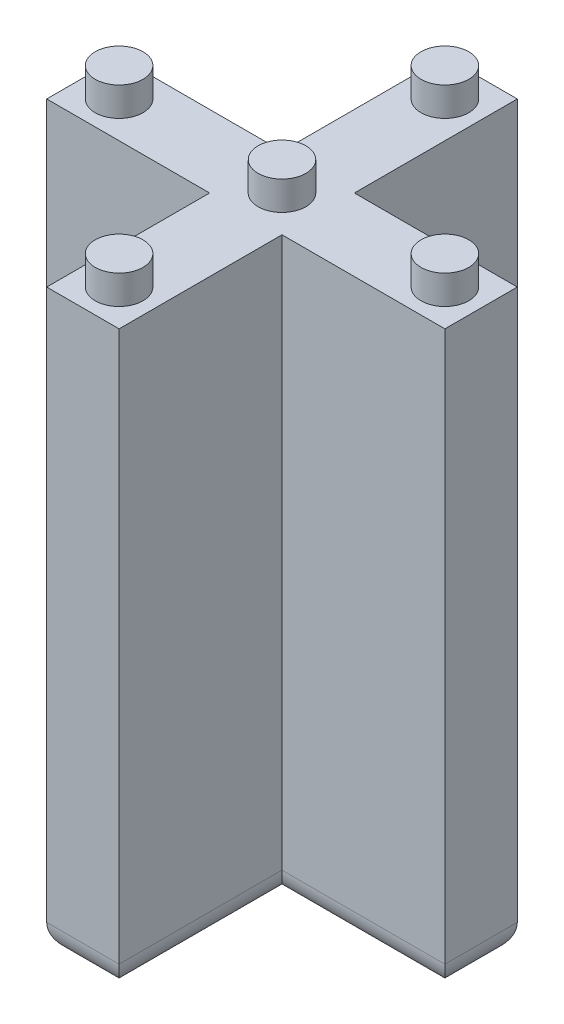
ISO-10303-21;
HEADER;
FILE_DESCRIPTION(('STEP AP214'),'2;1');
FILE_NAME('part.step','',(''),(''),'','','');
FILE_SCHEMA(('AUTOMOTIVE_DESIGN { 1 0 10303 214 1 1 1 1 }'));
ENDSEC;
DATA;
#1=APPLICATION_CONTEXT('core data for automotive mechanical design processes');
#2=APPLICATION_PROTOCOL_DEFINITION('international standard','automotive_design',2000,#1);
#3=PRODUCT_CONTEXT('',#1,'mechanical');
#4=PRODUCT('Part','Part','',(#3));
#5=PRODUCT_RELATED_PRODUCT_CATEGORY('part','',(#4));
#6=PRODUCT_DEFINITION_FORMATION('','',#4);
#7=PRODUCT_DEFINITION_CONTEXT('part definition',#1,'design');
#8=PRODUCT_DEFINITION('design','',#6,#7);
#9=PRODUCT_DEFINITION_SHAPE('','',#8);
#10=(LENGTH_UNIT() NAMED_UNIT(*) SI_UNIT(.MILLI.,.METRE.));
#11=(NAMED_UNIT(*) PLANE_ANGLE_UNIT() SI_UNIT($,.RADIAN.));
#12=(NAMED_UNIT(*) SI_UNIT($,.STERADIAN.) SOLID_ANGLE_UNIT());
#13=UNCERTAINTY_MEASURE_WITH_UNIT(LENGTH_MEASURE(1.E-05),#10,'distance_accuracy_value','');
#14=(GEOMETRIC_REPRESENTATION_CONTEXT(3) GLOBAL_UNCERTAINTY_ASSIGNED_CONTEXT((#13)) GLOBAL_UNIT_ASSIGNED_CONTEXT((#10,
#11,#12)) REPRESENTATION_CONTEXT('',''));
#15=CARTESIAN_POINT('',(0.,0.,0.));
#16=DIRECTION('',(0.,0.,1.));
#17=DIRECTION('',(1.,0.,0.));
#18=AXIS2_PLACEMENT_3D('',#15,#16,#17);
#19=CARTESIAN_POINT('',(0.,40.,-2.5));
#20=DIRECTION('',(0.,0.,-1.));
#21=DIRECTION('',(-1.,0.,0.));
#22=AXIS2_PLACEMENT_3D('',#19,#20,#21);
#23=PLANE('',#22);
#24=DIRECTION('',(0.,-1.,0.));
#25=VECTOR('',#24,1.);
#26=CARTESIAN_POINT('',(13.75,40.,-2.5));
#27=LINE('',#26,#25);
#28=CARTESIAN_POINT('',(13.75,40.,-2.5));
#29=VERTEX_POINT('',#28);
#30=CARTESIAN_POINT('',(13.75,2.,-2.5));
#31=VERTEX_POINT('',#30);
#32=EDGE_CURVE('E215',#29,#31,#27,.T.);
#33=ORIENTED_EDGE('',*,*,#32,.T.);
#34=DIRECTION('',(1.,0.,0.));
#35=VECTOR('',#34,1.);
#36=CARTESIAN_POINT('',(2.5,2.,-2.5));
#37=LINE('',#36,#35);
#38=CARTESIAN_POINT('',(2.5,2.,-2.5));
#39=VERTEX_POINT('',#38);
#40=EDGE_CURVE('E11',#31,#39,#37,.F.);
#41=ORIENTED_EDGE('',*,*,#40,.T.);
#42=DIRECTION('',(0.,-1.,0.));
#43=VECTOR('',#42,1.);
#44=CARTESIAN_POINT('',(2.5,40.,-2.5));
#45=LINE('',#44,#43);
#46=CARTESIAN_POINT('',(2.5,40.,-2.5));
#47=VERTEX_POINT('',#46);
#48=EDGE_CURVE('E163',#47,#39,#45,.T.);
#49=ORIENTED_EDGE('',*,*,#48,.F.);
#50=DIRECTION('',(1.,0.,0.));
#51=VECTOR('',#50,1.);
#52=CARTESIAN_POINT('',(0.,40.,-2.5));
#53=LINE('',#52,#51);
#54=EDGE_CURVE('E166',#47,#29,#53,.T.);
#55=ORIENTED_EDGE('',*,*,#54,.T.);
#56=EDGE_LOOP('',(#33,#41,#49,#55));
#57=FACE_BOUND('',#56,.T.);
#58=ADVANCED_FACE('F35',(#57),#23,.T.);
#59=CARTESIAN_POINT('',(2.5,40.,0.));
#60=DIRECTION('',(-1.,0.,0.));
#61=DIRECTION('',(0.,0.,1.));
#62=AXIS2_PLACEMENT_3D('',#59,#60,#61);
#63=PLANE('',#62);
#64=ORIENTED_EDGE('',*,*,#48,.T.);
#65=DIRECTION('',(0.,0.,-1.));
#66=VECTOR('',#65,1.);
#67=CARTESIAN_POINT('',(2.5,2.,0.));
#68=LINE('',#67,#66);
#69=CARTESIAN_POINT('',(2.5,2.,-13.75));
#70=VERTEX_POINT('',#69);
#71=EDGE_CURVE('E248',#39,#70,#68,.T.);
#72=ORIENTED_EDGE('',*,*,#71,.T.);
#73=DIRECTION('',(0.,-1.,0.));
#74=VECTOR('',#73,1.);
#75=CARTESIAN_POINT('',(2.5,40.,-13.75));
#76=LINE('',#75,#74);
#77=CARTESIAN_POINT('',(2.5,40.,-13.75));
#78=VERTEX_POINT('',#77);
#79=EDGE_CURVE('E172',#78,#70,#76,.T.);
#80=ORIENTED_EDGE('',*,*,#79,.F.);
#81=DIRECTION('',(0.,0.,-1.));
#82=VECTOR('',#81,1.);
#83=CARTESIAN_POINT('',(2.5,40.,0.));
#84=LINE('',#83,#82);
#85=EDGE_CURVE('E175',#47,#78,#84,.T.);
#86=ORIENTED_EDGE('',*,*,#85,.F.);
#87=EDGE_LOOP('',(#64,#72,#80,#86));
#88=FACE_BOUND('',#87,.T.);
#89=ADVANCED_FACE('F176',(#88),#63,.F.);
#90=CARTESIAN_POINT('',(0.,40.,-13.75));
#91=DIRECTION('',(0.,0.,-1.));
#92=DIRECTION('',(-1.,0.,0.));
#93=AXIS2_PLACEMENT_3D('',#90,#91,#92);
#94=PLANE('',#93);
#95=ORIENTED_EDGE('',*,*,#79,.T.);
#96=DIRECTION('',(1.,0.,0.));
#97=VECTOR('',#96,1.);
#98=CARTESIAN_POINT('',(-2.5,2.,-13.75));
#99=LINE('',#98,#97);
#100=CARTESIAN_POINT('',(-2.5,2.,-13.75));
#101=VERTEX_POINT('',#100);
#102=EDGE_CURVE('E275',#70,#101,#99,.F.);
#103=ORIENTED_EDGE('',*,*,#102,.T.);
#104=DIRECTION('',(0.,-1.,0.));
#105=VECTOR('',#104,1.);
#106=CARTESIAN_POINT('',(-2.5,40.,-13.75));
#107=LINE('',#106,#105);
#108=CARTESIAN_POINT('',(-2.5,40.,-13.75));
#109=VERTEX_POINT('',#108);
#110=EDGE_CURVE('E239',#109,#101,#107,.T.);
#111=ORIENTED_EDGE('',*,*,#110,.F.);
#112=DIRECTION('',(1.,0.,0.));
#113=VECTOR('',#112,1.);
#114=CARTESIAN_POINT('',(0.,40.,-13.75));
#115=LINE('',#114,#113);
#116=EDGE_CURVE('E181',#109,#78,#115,.T.);
#117=ORIENTED_EDGE('',*,*,#116,.T.);
#118=EDGE_LOOP('',(#95,#103,#111,#117));
#119=FACE_BOUND('',#118,.T.);
#120=ADVANCED_FACE('F384',(#119),#94,.T.);
#121=CARTESIAN_POINT('',(-2.5,40.,0.));
#122=DIRECTION('',(-1.,0.,0.));
#123=DIRECTION('',(0.,0.,1.));
#124=AXIS2_PLACEMENT_3D('',#121,#122,#123);
#125=PLANE('',#124);
#126=ORIENTED_EDGE('',*,*,#110,.T.);
#127=DIRECTION('',(0.,0.,-1.));
#128=VECTOR('',#127,1.);
#129=CARTESIAN_POINT('',(-2.5,2.,-2.5));
#130=LINE('',#129,#128);
#131=CARTESIAN_POINT('',(-2.5,2.,-2.5));
#132=VERTEX_POINT('',#131);
#133=EDGE_CURVE('E277',#101,#132,#130,.F.);
#134=ORIENTED_EDGE('',*,*,#133,.T.);
#135=DIRECTION('',(0.,-1.,0.));
#136=VECTOR('',#135,1.);
#137=CARTESIAN_POINT('',(-2.5,40.,-2.5));
#138=LINE('',#137,#136);
#139=CARTESIAN_POINT('',(-2.5,40.,-2.5));
#140=VERTEX_POINT('',#139);
#141=EDGE_CURVE('E236',#140,#132,#138,.T.);
#142=ORIENTED_EDGE('',*,*,#141,.F.);
#143=DIRECTION('',(0.,0.,-1.));
#144=VECTOR('',#143,1.);
#145=CARTESIAN_POINT('',(-2.5,40.,0.));
#146=LINE('',#145,#144);
#147=EDGE_CURVE('E194',#140,#109,#146,.T.);
#148=ORIENTED_EDGE('',*,*,#147,.T.);
#149=EDGE_LOOP('',(#126,#134,#142,#148));
#150=FACE_BOUND('',#149,.T.);
#151=ADVANCED_FACE('F487',(#150),#125,.T.);
#152=CARTESIAN_POINT('',(0.,40.,-2.5));
#153=DIRECTION('',(0.,0.,-1.));
#154=DIRECTION('',(-1.,0.,0.));
#155=AXIS2_PLACEMENT_3D('',#152,#153,#154);
#156=PLANE('',#155);
#157=ORIENTED_EDGE('',*,*,#141,.T.);
#158=DIRECTION('',(1.,0.,0.));
#159=VECTOR('',#158,1.);
#160=CARTESIAN_POINT('',(-13.75,2.,-2.5));
#161=LINE('',#160,#159);
#162=CARTESIAN_POINT('',(-13.75,2.,-2.5));
#163=VERTEX_POINT('',#162);
#164=EDGE_CURVE('E279',#132,#163,#161,.F.);
#165=ORIENTED_EDGE('',*,*,#164,.T.);
#166=DIRECTION('',(0.,-1.,0.));
#167=VECTOR('',#166,1.);
#168=CARTESIAN_POINT('',(-13.75,40.,-2.5));
#169=LINE('',#168,#167);
#170=CARTESIAN_POINT('',(-13.75,40.,-2.5));
#171=VERTEX_POINT('',#170);
#172=EDGE_CURVE('E233',#171,#163,#169,.T.);
#173=ORIENTED_EDGE('',*,*,#172,.F.);
#174=DIRECTION('',(1.,0.,0.));
#175=VECTOR('',#174,1.);
#176=CARTESIAN_POINT('',(0.,40.,-2.5));
#177=LINE('',#176,#175);
#178=EDGE_CURVE('E197',#171,#140,#177,.T.);
#179=ORIENTED_EDGE('',*,*,#178,.T.);
#180=EDGE_LOOP('',(#157,#165,#173,#179));
#181=FACE_BOUND('',#180,.T.);
#182=ADVANCED_FACE('F489',(#181),#156,.T.);
#183=CARTESIAN_POINT('',(-13.75,40.,0.));
#184=DIRECTION('',(-1.,0.,0.));
#185=DIRECTION('',(0.,0.,1.));
#186=AXIS2_PLACEMENT_3D('',#183,#184,#185);
#187=PLANE('',#186);
#188=ORIENTED_EDGE('',*,*,#172,.T.);
#189=DIRECTION('',(0.,0.,-1.));
#190=VECTOR('',#189,1.);
#191=CARTESIAN_POINT('',(-13.75,2.,2.5));
#192=LINE('',#191,#190);
#193=CARTESIAN_POINT('',(-13.75,2.,2.5));
#194=VERTEX_POINT('',#193);
#195=EDGE_CURVE('E281',#163,#194,#192,.F.);
#196=ORIENTED_EDGE('',*,*,#195,.T.);
#197=DIRECTION('',(0.,-1.,0.));
#198=VECTOR('',#197,1.);
#199=CARTESIAN_POINT('',(-13.75,40.,2.5));
#200=LINE('',#199,#198);
#201=CARTESIAN_POINT('',(-13.75,40.,2.5));
#202=VERTEX_POINT('',#201);
#203=EDGE_CURVE('E230',#202,#194,#200,.T.);
#204=ORIENTED_EDGE('',*,*,#203,.F.);
#205=DIRECTION('',(0.,0.,-1.));
#206=VECTOR('',#205,1.);
#207=CARTESIAN_POINT('',(-13.75,40.,0.));
#208=LINE('',#207,#206);
#209=EDGE_CURVE('E200',#202,#171,#208,.T.);
#210=ORIENTED_EDGE('',*,*,#209,.T.);
#211=EDGE_LOOP('',(#188,#196,#204,#210));
#212=FACE_BOUND('',#211,.T.);
#213=ADVANCED_FACE('F491',(#212),#187,.T.);
#214=CARTESIAN_POINT('',(0.,40.,2.5));
#215=DIRECTION('',(0.,0.,-1.));
#216=DIRECTION('',(-1.,0.,0.));
#217=AXIS2_PLACEMENT_3D('',#214,#215,#216);
#218=PLANE('',#217);
#219=ORIENTED_EDGE('',*,*,#203,.T.);
#220=DIRECTION('',(1.,0.,0.));
#221=VECTOR('',#220,1.);
#222=CARTESIAN_POINT('',(0.,2.,2.5));
#223=LINE('',#222,#221);
#224=CARTESIAN_POINT('',(-2.5,2.,2.5));
#225=VERTEX_POINT('',#224);
#226=EDGE_CURVE('E283',#194,#225,#223,.T.);
#227=ORIENTED_EDGE('',*,*,#226,.T.);
#228=DIRECTION('',(0.,-1.,0.));
#229=VECTOR('',#228,1.);
#230=CARTESIAN_POINT('',(-2.5,40.,2.5));
#231=LINE('',#230,#229);
#232=CARTESIAN_POINT('',(-2.5,40.,2.5));
#233=VERTEX_POINT('',#232);
#234=EDGE_CURVE('E227',#233,#225,#231,.T.);
#235=ORIENTED_EDGE('',*,*,#234,.F.);
#236=DIRECTION('',(1.,0.,0.));
#237=VECTOR('',#236,1.);
#238=CARTESIAN_POINT('',(0.,40.,2.5));
#239=LINE('',#238,#237);
#240=EDGE_CURVE('E203',#202,#233,#239,.T.);
#241=ORIENTED_EDGE('',*,*,#240,.F.);
#242=EDGE_LOOP('',(#219,#227,#235,#241));
#243=FACE_BOUND('',#242,.T.);
#244=ADVANCED_FACE('F464',(#243),#218,.F.);
#245=CARTESIAN_POINT('',(-2.5,40.,0.));
#246=DIRECTION('',(-1.,0.,0.));
#247=DIRECTION('',(0.,0.,1.));
#248=AXIS2_PLACEMENT_3D('',#245,#246,#247);
#249=PLANE('',#248);
#250=ORIENTED_EDGE('',*,*,#234,.T.);
#251=DIRECTION('',(0.,0.,-1.));
#252=VECTOR('',#251,1.);
#253=CARTESIAN_POINT('',(-2.5,2.,13.75));
#254=LINE('',#253,#252);
#255=CARTESIAN_POINT('',(-2.5,2.,13.75));
#256=VERTEX_POINT('',#255);
#257=EDGE_CURVE('E285',#225,#256,#254,.F.);
#258=ORIENTED_EDGE('',*,*,#257,.T.);
#259=DIRECTION('',(0.,-1.,0.));
#260=VECTOR('',#259,1.);
#261=CARTESIAN_POINT('',(-2.5,40.,13.75));
#262=LINE('',#261,#260);
#263=CARTESIAN_POINT('',(-2.5,40.,13.75));
#264=VERTEX_POINT('',#263);
#265=EDGE_CURVE('E224',#264,#256,#262,.T.);
#266=ORIENTED_EDGE('',*,*,#265,.F.);
#267=DIRECTION('',(0.,0.,-1.));
#268=VECTOR('',#267,1.);
#269=CARTESIAN_POINT('',(-2.5,40.,0.));
#270=LINE('',#269,#268);
#271=EDGE_CURVE('E205',#264,#233,#270,.T.);
#272=ORIENTED_EDGE('',*,*,#271,.T.);
#273=EDGE_LOOP('',(#250,#258,#266,#272));
#274=FACE_BOUND('',#273,.T.);
#275=ADVANCED_FACE('F460',(#274),#249,.T.);
#276=CARTESIAN_POINT('',(0.,40.,13.75));
#277=DIRECTION('',(0.,0.,-1.));
#278=DIRECTION('',(-1.,0.,0.));
#279=AXIS2_PLACEMENT_3D('',#276,#277,#278);
#280=PLANE('',#279);
#281=ORIENTED_EDGE('',*,*,#265,.T.);
#282=DIRECTION('',(1.,0.,0.));
#283=VECTOR('',#282,1.);
#284=CARTESIAN_POINT('',(0.,2.,13.75));
#285=LINE('',#284,#283);
#286=CARTESIAN_POINT('',(2.5,2.,13.75));
#287=VERTEX_POINT('',#286);
#288=EDGE_CURVE('E287',#256,#287,#285,.T.);
#289=ORIENTED_EDGE('',*,*,#288,.T.);
#290=DIRECTION('',(0.,-1.,0.));
#291=VECTOR('',#290,1.);
#292=CARTESIAN_POINT('',(2.5,40.,13.75));
#293=LINE('',#292,#291);
#294=CARTESIAN_POINT('',(2.5,40.,13.75));
#295=VERTEX_POINT('',#294);
#296=EDGE_CURVE('E221',#295,#287,#293,.T.);
#297=ORIENTED_EDGE('',*,*,#296,.F.);
#298=DIRECTION('',(1.,0.,0.));
#299=VECTOR('',#298,1.);
#300=CARTESIAN_POINT('',(0.,40.,13.75));
#301=LINE('',#300,#299);
#302=EDGE_CURVE('E208',#264,#295,#301,.T.);
#303=ORIENTED_EDGE('',*,*,#302,.F.);
#304=EDGE_LOOP('',(#281,#289,#297,#303));
#305=FACE_BOUND('',#304,.T.);
#306=ADVANCED_FACE('F458',(#305),#280,.F.);
#307=CARTESIAN_POINT('',(2.5,40.,0.));
#308=DIRECTION('',(-1.,0.,0.));
#309=DIRECTION('',(0.,0.,1.));
#310=AXIS2_PLACEMENT_3D('',#307,#308,#309);
#311=PLANE('',#310);
#312=ORIENTED_EDGE('',*,*,#296,.T.);
#313=DIRECTION('',(0.,0.,-1.));
#314=VECTOR('',#313,1.);
#315=CARTESIAN_POINT('',(2.5,2.,0.));
#316=LINE('',#315,#314);
#317=CARTESIAN_POINT('',(2.5,2.,2.5));
#318=VERTEX_POINT('',#317);
#319=EDGE_CURVE('E289',#287,#318,#316,.T.);
#320=ORIENTED_EDGE('',*,*,#319,.T.);
#321=DIRECTION('',(0.,-1.,0.));
#322=VECTOR('',#321,1.);
#323=CARTESIAN_POINT('',(2.5,40.,2.5));
#324=LINE('',#323,#322);
#325=CARTESIAN_POINT('',(2.5,40.,2.5));
#326=VERTEX_POINT('',#325);
#327=EDGE_CURVE('E219',#326,#318,#324,.T.);
#328=ORIENTED_EDGE('',*,*,#327,.F.);
#329=DIRECTION('',(0.,0.,-1.));
#330=VECTOR('',#329,1.);
#331=CARTESIAN_POINT('',(2.5,40.,0.));
#332=LINE('',#331,#330);
#333=EDGE_CURVE('E210',#295,#326,#332,.T.);
#334=ORIENTED_EDGE('',*,*,#333,.F.);
#335=EDGE_LOOP('',(#312,#320,#328,#334));
#336=FACE_BOUND('',#335,.T.);
#337=ADVANCED_FACE('F450',(#336),#311,.F.);
#338=CARTESIAN_POINT('',(0.,40.,2.5));
#339=DIRECTION('',(0.,0.,-1.));
#340=DIRECTION('',(-1.,0.,0.));
#341=AXIS2_PLACEMENT_3D('',#338,#339,#340);
#342=PLANE('',#341);
#343=ORIENTED_EDGE('',*,*,#327,.T.);
#344=DIRECTION('',(1.,0.,0.));
#345=VECTOR('',#344,1.);
#346=CARTESIAN_POINT('',(0.,2.,2.5));
#347=LINE('',#346,#345);
#348=CARTESIAN_POINT('',(13.75,2.,2.5));
#349=VERTEX_POINT('',#348);
#350=EDGE_CURVE('E59',#318,#349,#347,.T.);
#351=ORIENTED_EDGE('',*,*,#350,.T.);
#352=DIRECTION('',(0.,-1.,0.));
#353=VECTOR('',#352,1.);
#354=CARTESIAN_POINT('',(13.75,40.,2.5));
#355=LINE('',#354,#353);
#356=CARTESIAN_POINT('',(13.75,40.,2.5));
#357=VERTEX_POINT('',#356);
#358=EDGE_CURVE('E217',#357,#349,#355,.T.);
#359=ORIENTED_EDGE('',*,*,#358,.F.);
#360=DIRECTION('',(1.,0.,0.));
#361=VECTOR('',#360,1.);
#362=CARTESIAN_POINT('',(0.,40.,2.5));
#363=LINE('',#362,#361);
#364=EDGE_CURVE('E212',#326,#357,#363,.T.);
#365=ORIENTED_EDGE('',*,*,#364,.F.);
#366=EDGE_LOOP('',(#343,#351,#359,#365));
#367=FACE_BOUND('',#366,.T.);
#368=ADVANCED_FACE('F454',(#367),#342,.F.);
#369=CARTESIAN_POINT('',(13.75,40.,0.));
#370=DIRECTION('',(-1.,0.,0.));
#371=DIRECTION('',(0.,0.,1.));
#372=AXIS2_PLACEMENT_3D('',#369,#370,#371);
#373=PLANE('',#372);
#374=ORIENTED_EDGE('',*,*,#358,.T.);
#375=DIRECTION('',(0.,0.,-1.));
#376=VECTOR('',#375,1.);
#377=CARTESIAN_POINT('',(13.75,2.,0.));
#378=LINE('',#377,#376);
#379=EDGE_CURVE('E44',#349,#31,#378,.T.);
#380=ORIENTED_EDGE('',*,*,#379,.T.);
#381=ORIENTED_EDGE('',*,*,#32,.F.);
#382=DIRECTION('',(0.,0.,-1.));
#383=VECTOR('',#382,1.);
#384=CARTESIAN_POINT('',(13.75,40.,0.));
#385=LINE('',#384,#383);
#386=EDGE_CURVE('E185',#357,#29,#385,.T.);
#387=ORIENTED_EDGE('',*,*,#386,.F.);
#388=EDGE_LOOP('',(#374,#380,#381,#387));
#389=FACE_BOUND('',#388,.T.);
#390=ADVANCED_FACE('F359',(#389),#373,.F.);
#391=CARTESIAN_POINT('',(0.,40.,0.));
#392=DIRECTION('',(0.,1.,0.));
#393=DIRECTION('',(0.,0.,1.));
#394=AXIS2_PLACEMENT_3D('',#391,#392,#393);
#395=PLANE('',#394);
#396=CARTESIAN_POINT('',(0.,40.,11.25));
#397=DIRECTION('',(0.,1.,0.));
#398=DIRECTION('',(0.,0.,1.));
#399=AXIS2_PLACEMENT_3D('',#396,#397,#398);
#400=CIRCLE('',#399,1.65);
#401=CARTESIAN_POINT('',(0.,40.,12.9));
#402=VERTEX_POINT('',#401);
#403=EDGE_CURVE('E245',#402,#402,#400,.T.);
#404=ORIENTED_EDGE('',*,*,#403,.F.);
#405=EDGE_LOOP('',(#404));
#406=FACE_BOUND('',#405,.T.);
#407=CARTESIAN_POINT('',(11.25,40.,0.));
#408=DIRECTION('',(0.,1.,0.));
#409=DIRECTION('',(0.,0.,1.));
#410=AXIS2_PLACEMENT_3D('',#407,#408,#409);
#411=CIRCLE('',#410,1.65);
#412=CARTESIAN_POINT('',(11.25,40.,1.65));
#413=VERTEX_POINT('',#412);
#414=EDGE_CURVE('E333',#413,#413,#411,.T.);
#415=ORIENTED_EDGE('',*,*,#414,.F.);
#416=EDGE_LOOP('',(#415));
#417=FACE_BOUND('',#416,.T.);
#418=CARTESIAN_POINT('',(0.,40.,-11.25));
#419=DIRECTION('',(0.,1.,0.));
#420=DIRECTION('',(0.,0.,1.));
#421=AXIS2_PLACEMENT_3D('',#418,#419,#420);
#422=CIRCLE('',#421,1.65);
#423=CARTESIAN_POINT('',(0.,40.,-9.6));
#424=VERTEX_POINT('',#423);
#425=EDGE_CURVE('E342',#424,#424,#422,.T.);
#426=ORIENTED_EDGE('',*,*,#425,.F.);
#427=EDGE_LOOP('',(#426));
#428=FACE_BOUND('',#427,.T.);
#429=CARTESIAN_POINT('',(0.,40.,0.));
#430=DIRECTION('',(0.,1.,0.));
#431=DIRECTION('',(0.,0.,1.));
#432=AXIS2_PLACEMENT_3D('',#429,#430,#431);
#433=CIRCLE('',#432,1.65);
#434=CARTESIAN_POINT('',(0.,40.,1.65));
#435=VERTEX_POINT('',#434);
#436=EDGE_CURVE('E347',#435,#435,#433,.T.);
#437=ORIENTED_EDGE('',*,*,#436,.F.);
#438=EDGE_LOOP('',(#437));
#439=FACE_BOUND('',#438,.T.);
#440=CARTESIAN_POINT('',(-11.25,40.,0.));
#441=DIRECTION('',(0.,1.,0.));
#442=DIRECTION('',(0.,0.,1.));
#443=AXIS2_PLACEMENT_3D('',#440,#441,#442);
#444=CIRCLE('',#443,1.65);
#445=CARTESIAN_POINT('',(-11.25,40.,1.65));
#446=VERTEX_POINT('',#445);
#447=EDGE_CURVE('E171',#446,#446,#444,.T.);
#448=ORIENTED_EDGE('',*,*,#447,.F.);
#449=EDGE_LOOP('',(#448));
#450=FACE_BOUND('',#449,.T.);
#451=ORIENTED_EDGE('',*,*,#54,.F.);
#452=ORIENTED_EDGE('',*,*,#85,.T.);
#453=ORIENTED_EDGE('',*,*,#116,.F.);
#454=ORIENTED_EDGE('',*,*,#147,.F.);
#455=ORIENTED_EDGE('',*,*,#178,.F.);
#456=ORIENTED_EDGE('',*,*,#209,.F.);
#457=ORIENTED_EDGE('',*,*,#240,.T.);
#458=ORIENTED_EDGE('',*,*,#271,.F.);
#459=ORIENTED_EDGE('',*,*,#302,.T.);
#460=ORIENTED_EDGE('',*,*,#333,.T.);
#461=ORIENTED_EDGE('',*,*,#364,.T.);
#462=ORIENTED_EDGE('',*,*,#386,.T.);
#463=EDGE_LOOP('',(#451,#452,#453,#454,#455,#456,#457,#458,#459,#460,#461,#462));
#464=FACE_BOUND('',#463,.T.);
#465=ADVANCED_FACE('F183',(#406,#417,#428,#439,#450,#464),#395,.T.);
#466=CARTESIAN_POINT('',(0.,0.,0.));
#467=DIRECTION('',(0.,1.,0.));
#468=DIRECTION('',(0.,0.,1.));
#469=AXIS2_PLACEMENT_3D('',#466,#467,#468);
#470=PLANE('',#469);
#471=DIRECTION('',(1.,0.,0.));
#472=VECTOR('',#471,1.);
#473=CARTESIAN_POINT('',(2.5,0.,-11.75));
#474=LINE('',#473,#472);
#475=CARTESIAN_POINT('',(-0.499999999999999,0.,-11.75));
#476=VERTEX_POINT('',#475);
#477=CARTESIAN_POINT('',(0.500000000000001,0.,-11.75));
#478=VERTEX_POINT('',#477);
#479=EDGE_CURVE('E270',#476,#478,#474,.T.);
#480=ORIENTED_EDGE('',*,*,#479,.T.);
#481=DIRECTION('',(0.,0.,-1.));
#482=VECTOR('',#481,1.);
#483=CARTESIAN_POINT('',(0.500000000000001,0.,0.));
#484=LINE('',#483,#482);
#485=CARTESIAN_POINT('',(0.500000000000001,0.,-0.5));
#486=VERTEX_POINT('',#485);
#487=EDGE_CURVE('E272',#478,#486,#484,.F.);
#488=ORIENTED_EDGE('',*,*,#487,.T.);
#489=DIRECTION('',(1.,0.,0.));
#490=VECTOR('',#489,1.);
#491=CARTESIAN_POINT('',(13.75,0.,-0.5));
#492=LINE('',#491,#490);
#493=CARTESIAN_POINT('',(11.75,0.,-0.5));
#494=VERTEX_POINT('',#493);
#495=EDGE_CURVE('E250',#486,#494,#492,.T.);
#496=ORIENTED_EDGE('',*,*,#495,.T.);
#497=DIRECTION('',(0.,0.,-1.));
#498=VECTOR('',#497,1.);
#499=CARTESIAN_POINT('',(11.75,0.,0.));
#500=LINE('',#499,#498);
#501=CARTESIAN_POINT('',(11.75,0.,0.499999999999999));
#502=VERTEX_POINT('',#501);
#503=EDGE_CURVE('E252',#494,#502,#500,.F.);
#504=ORIENTED_EDGE('',*,*,#503,.T.);
#505=DIRECTION('',(1.,0.,0.));
#506=VECTOR('',#505,1.);
#507=CARTESIAN_POINT('',(0.,0.,0.499999999999997));
#508=LINE('',#507,#506);
#509=CARTESIAN_POINT('',(0.500000000000001,0.,0.499999999999997));
#510=VERTEX_POINT('',#509);
#511=EDGE_CURVE('E254',#502,#510,#508,.F.);
#512=ORIENTED_EDGE('',*,*,#511,.T.);
#513=DIRECTION('',(0.,0.,-1.));
#514=VECTOR('',#513,1.);
#515=CARTESIAN_POINT('',(0.500000000000001,0.,0.));
#516=LINE('',#515,#514);
#517=CARTESIAN_POINT('',(0.500000000000001,0.,11.75));
#518=VERTEX_POINT('',#517);
#519=EDGE_CURVE('E256',#510,#518,#516,.F.);
#520=ORIENTED_EDGE('',*,*,#519,.T.);
#521=DIRECTION('',(1.,0.,0.));
#522=VECTOR('',#521,1.);
#523=CARTESIAN_POINT('',(0.,0.,11.75));
#524=LINE('',#523,#522);
#525=CARTESIAN_POINT('',(-0.499999999999999,0.,11.75));
#526=VERTEX_POINT('',#525);
#527=EDGE_CURVE('E258',#518,#526,#524,.F.);
#528=ORIENTED_EDGE('',*,*,#527,.T.);
#529=DIRECTION('',(0.,0.,-1.));
#530=VECTOR('',#529,1.);
#531=CARTESIAN_POINT('',(-0.499999999999999,0.,2.5));
#532=LINE('',#531,#530);
#533=CARTESIAN_POINT('',(-0.499999999999999,0.,0.5));
#534=VERTEX_POINT('',#533);
#535=EDGE_CURVE('E260',#526,#534,#532,.T.);
#536=ORIENTED_EDGE('',*,*,#535,.T.);
#537=DIRECTION('',(1.,0.,0.));
#538=VECTOR('',#537,1.);
#539=CARTESIAN_POINT('',(0.,0.,0.5));
#540=LINE('',#539,#538);
#541=CARTESIAN_POINT('',(-11.75,0.,0.499999999999999));
#542=VERTEX_POINT('',#541);
#543=EDGE_CURVE('E262',#534,#542,#540,.F.);
#544=ORIENTED_EDGE('',*,*,#543,.T.);
#545=DIRECTION('',(0.,0.,-1.));
#546=VECTOR('',#545,1.);
#547=CARTESIAN_POINT('',(-11.75,0.,-2.5));
#548=LINE('',#547,#546);
#549=CARTESIAN_POINT('',(-11.75,0.,-0.5));
#550=VERTEX_POINT('',#549);
#551=EDGE_CURVE('E264',#542,#550,#548,.T.);
#552=ORIENTED_EDGE('',*,*,#551,.T.);
#553=DIRECTION('',(1.,0.,0.));
#554=VECTOR('',#553,1.);
#555=CARTESIAN_POINT('',(-2.5,0.,-0.5));
#556=LINE('',#555,#554);
#557=CARTESIAN_POINT('',(-0.499999999999999,0.,-0.5));
#558=VERTEX_POINT('',#557);
#559=EDGE_CURVE('E266',#550,#558,#556,.T.);
#560=ORIENTED_EDGE('',*,*,#559,.T.);
#561=DIRECTION('',(0.,0.,-1.));
#562=VECTOR('',#561,1.);
#563=CARTESIAN_POINT('',(-0.499999999999999,0.,-13.75));
#564=LINE('',#563,#562);
#565=EDGE_CURVE('E268',#558,#476,#564,.T.);
#566=ORIENTED_EDGE('',*,*,#565,.T.);
#567=EDGE_LOOP('',(#480,#488,#496,#504,#512,#520,#528,#536,#544,#552,#560,#566));
#568=FACE_BOUND('',#567,.T.);
#569=ADVANCED_FACE('F358',(#568),#470,.F.);
#570=CARTESIAN_POINT('',(-11.25,42.,0.));
#571=DIRECTION('',(0.,-1.,0.));
#572=DIRECTION('',(0.,0.,-1.));
#573=AXIS2_PLACEMENT_3D('',#570,#571,#572);
#574=CYLINDRICAL_SURFACE('',#573,1.65);
#575=CARTESIAN_POINT('',(-11.25,42.,0.));
#576=DIRECTION('',(0.,1.,0.));
#577=DIRECTION('',(0.,0.,1.));
#578=AXIS2_PLACEMENT_3D('',#575,#576,#577);
#579=CIRCLE('',#578,1.65);
#580=CARTESIAN_POINT('',(-11.25,42.,1.65));
#581=VERTEX_POINT('',#580);
#582=EDGE_CURVE('E186',#581,#581,#579,.F.);
#583=ORIENTED_EDGE('',*,*,#582,.T.);
#584=EDGE_LOOP('',(#583));
#585=FACE_BOUND('',#584,.T.);
#586=ORIENTED_EDGE('',*,*,#447,.T.);
#587=EDGE_LOOP('',(#586));
#588=FACE_BOUND('',#587,.T.);
#589=ADVANCED_FACE('F364',(#585,#588),#574,.T.);
#590=CARTESIAN_POINT('',(0.,42.,0.));
#591=DIRECTION('',(0.,1.,0.));
#592=DIRECTION('',(0.,0.,1.));
#593=AXIS2_PLACEMENT_3D('',#590,#591,#592);
#594=PLANE('',#593);
#595=ORIENTED_EDGE('',*,*,#582,.F.);
#596=EDGE_LOOP('',(#595));
#597=FACE_BOUND('',#596,.T.);
#598=ADVANCED_FACE('F366',(#597),#594,.T.);
#599=CARTESIAN_POINT('',(0.,42.,0.));
#600=DIRECTION('',(0.,-1.,0.));
#601=DIRECTION('',(0.,0.,-1.));
#602=AXIS2_PLACEMENT_3D('',#599,#600,#601);
#603=CYLINDRICAL_SURFACE('',#602,1.65);
#604=CARTESIAN_POINT('',(0.,42.,0.));
#605=DIRECTION('',(0.,1.,0.));
#606=DIRECTION('',(0.,0.,1.));
#607=AXIS2_PLACEMENT_3D('',#604,#605,#606);
#608=CIRCLE('',#607,1.65);
#609=CARTESIAN_POINT('',(0.,42.,1.65));
#610=VERTEX_POINT('',#609);
#611=EDGE_CURVE('E189',#610,#610,#608,.T.);
#612=ORIENTED_EDGE('',*,*,#611,.F.);
#613=EDGE_LOOP('',(#612));
#614=FACE_BOUND('',#613,.T.);
#615=ORIENTED_EDGE('',*,*,#436,.T.);
#616=EDGE_LOOP('',(#615));
#617=FACE_BOUND('',#616,.T.);
#618=ADVANCED_FACE('F354',(#614,#617),#603,.T.);
#619=CARTESIAN_POINT('',(0.,42.,0.));
#620=DIRECTION('',(0.,1.,0.));
#621=DIRECTION('',(0.,0.,1.));
#622=AXIS2_PLACEMENT_3D('',#619,#620,#621);
#623=PLANE('',#622);
#624=ORIENTED_EDGE('',*,*,#611,.T.);
#625=EDGE_LOOP('',(#624));
#626=FACE_BOUND('',#625,.T.);
#627=ADVANCED_FACE('F694',(#626),#623,.T.);
#628=CARTESIAN_POINT('',(0.,42.,-11.25));
#629=DIRECTION('',(0.,-1.,0.));
#630=DIRECTION('',(0.,0.,-1.));
#631=AXIS2_PLACEMENT_3D('',#628,#629,#630);
#632=CYLINDRICAL_SURFACE('',#631,1.65);
#633=CARTESIAN_POINT('',(0.,42.,-11.25));
#634=DIRECTION('',(0.,1.,0.));
#635=DIRECTION('',(0.,0.,1.));
#636=AXIS2_PLACEMENT_3D('',#633,#634,#635);
#637=CIRCLE('',#636,1.65);
#638=CARTESIAN_POINT('',(0.,42.,-9.6));
#639=VERTEX_POINT('',#638);
#640=EDGE_CURVE('E344',#639,#639,#637,.T.);
#641=ORIENTED_EDGE('',*,*,#640,.F.);
#642=EDGE_LOOP('',(#641));
#643=FACE_BOUND('',#642,.T.);
#644=ORIENTED_EDGE('',*,*,#425,.T.);
#645=EDGE_LOOP('',(#644));
#646=FACE_BOUND('',#645,.T.);
#647=ADVANCED_FACE('F685',(#643,#646),#632,.T.);
#648=CARTESIAN_POINT('',(0.,42.,0.));
#649=DIRECTION('',(0.,1.,0.));
#650=DIRECTION('',(0.,0.,1.));
#651=AXIS2_PLACEMENT_3D('',#648,#649,#650);
#652=PLANE('',#651);
#653=ORIENTED_EDGE('',*,*,#640,.T.);
#654=EDGE_LOOP('',(#653));
#655=FACE_BOUND('',#654,.T.);
#656=ADVANCED_FACE('F676',(#655),#652,.T.);
#657=CARTESIAN_POINT('',(11.25,42.,0.));
#658=DIRECTION('',(0.,-1.,0.));
#659=DIRECTION('',(0.,0.,-1.));
#660=AXIS2_PLACEMENT_3D('',#657,#658,#659);
#661=CYLINDRICAL_SURFACE('',#660,1.65);
#662=CARTESIAN_POINT('',(11.25,42.,0.));
#663=DIRECTION('',(0.,1.,0.));
#664=DIRECTION('',(0.,0.,1.));
#665=AXIS2_PLACEMENT_3D('',#662,#663,#664);
#666=CIRCLE('',#665,1.65);
#667=CARTESIAN_POINT('',(11.25,42.,1.65));
#668=VERTEX_POINT('',#667);
#669=EDGE_CURVE('E338',#668,#668,#666,.T.);
#670=ORIENTED_EDGE('',*,*,#669,.F.);
#671=EDGE_LOOP('',(#670));
#672=FACE_BOUND('',#671,.T.);
#673=ORIENTED_EDGE('',*,*,#414,.T.);
#674=EDGE_LOOP('',(#673));
#675=FACE_BOUND('',#674,.T.);
#676=ADVANCED_FACE('F667',(#672,#675),#661,.T.);
#677=CARTESIAN_POINT('',(0.,42.,0.));
#678=DIRECTION('',(0.,1.,0.));
#679=DIRECTION('',(0.,0.,1.));
#680=AXIS2_PLACEMENT_3D('',#677,#678,#679);
#681=PLANE('',#680);
#682=ORIENTED_EDGE('',*,*,#669,.T.);
#683=EDGE_LOOP('',(#682));
#684=FACE_BOUND('',#683,.T.);
#685=ADVANCED_FACE('F659',(#684),#681,.T.);
#686=CARTESIAN_POINT('',(0.,42.,11.25));
#687=DIRECTION('',(0.,-1.,0.));
#688=DIRECTION('',(0.,0.,-1.));
#689=AXIS2_PLACEMENT_3D('',#686,#687,#688);
#690=CYLINDRICAL_SURFACE('',#689,1.65);
#691=CARTESIAN_POINT('',(0.,42.,11.25));
#692=DIRECTION('',(0.,1.,0.));
#693=DIRECTION('',(0.,0.,1.));
#694=AXIS2_PLACEMENT_3D('',#691,#692,#693);
#695=CIRCLE('',#694,1.65);
#696=CARTESIAN_POINT('',(0.,42.,12.9));
#697=VERTEX_POINT('',#696);
#698=EDGE_CURVE('E327',#697,#697,#695,.F.);
#699=ORIENTED_EDGE('',*,*,#698,.T.);
#700=EDGE_LOOP('',(#699));
#701=FACE_BOUND('',#700,.T.);
#702=ORIENTED_EDGE('',*,*,#403,.T.);
#703=EDGE_LOOP('',(#702));
#704=FACE_BOUND('',#703,.T.);
#705=ADVANCED_FACE('F436',(#701,#704),#690,.T.);
#706=CARTESIAN_POINT('',(0.,42.,0.));
#707=DIRECTION('',(0.,1.,0.));
#708=DIRECTION('',(0.,0.,1.));
#709=AXIS2_PLACEMENT_3D('',#706,#707,#708);
#710=PLANE('',#709);
#711=ORIENTED_EDGE('',*,*,#698,.F.);
#712=EDGE_LOOP('',(#711));
#713=FACE_BOUND('',#712,.T.);
#714=ADVANCED_FACE('F431',(#713),#710,.T.);
#715=CARTESIAN_POINT('',(-0.499999999999999,2.,0.));
#716=DIRECTION('',(0.,0.,1.));
#717=DIRECTION('',(1.,0.,0.));
#718=AXIS2_PLACEMENT_3D('',#715,#716,#717);
#719=CYLINDRICAL_SURFACE('',#718,2.);
#720=CARTESIAN_POINT('',(-0.499999999999999,2.,0.5));
#721=DIRECTION('',(0.707106781186547,0.,0.707106781186547));
#722=DIRECTION('',(0.707106781186548,0.,-0.707106781186547));
#723=AXIS2_PLACEMENT_3D('',#720,#721,#722);
#724=ELLIPSE('',#723,2.82842712474619,2.);
#725=EDGE_CURVE('E320',#534,#225,#724,.F.);
#726=ORIENTED_EDGE('',*,*,#725,.F.);
#727=ORIENTED_EDGE('',*,*,#535,.F.);
#728=CARTESIAN_POINT('',(-0.499999999999999,2.,11.75));
#729=DIRECTION('',(0.707106781186547,0.,0.707106781186547));
#730=DIRECTION('',(0.707106781186547,0.,-0.707106781186547));
#731=AXIS2_PLACEMENT_3D('',#728,#729,#730);
#732=ELLIPSE('',#731,2.82842712474619,2.);
#733=EDGE_CURVE('E39',#256,#526,#732,.T.);
#734=ORIENTED_EDGE('',*,*,#733,.F.);
#735=ORIENTED_EDGE('',*,*,#257,.F.);
#736=EDGE_LOOP('',(#726,#727,#734,#735));
#737=FACE_BOUND('',#736,.T.);
#738=ADVANCED_FACE('F37',(#737),#719,.T.);
#739=CARTESIAN_POINT('',(0.,2.,11.75));
#740=DIRECTION('',(1.,0.,0.));
#741=DIRECTION('',(0.,0.,-1.));
#742=AXIS2_PLACEMENT_3D('',#739,#740,#741);
#743=CYLINDRICAL_SURFACE('',#742,2.);
#744=ORIENTED_EDGE('',*,*,#733,.T.);
#745=ORIENTED_EDGE('',*,*,#527,.F.);
#746=CARTESIAN_POINT('',(0.500000000000001,2.,11.75));
#747=DIRECTION('',(0.707106781186547,0.,-0.707106781186547));
#748=DIRECTION('',(-0.707106781186547,0.,-0.707106781186547));
#749=AXIS2_PLACEMENT_3D('',#746,#747,#748);
#750=ELLIPSE('',#749,2.82842712474619,2.);
#751=EDGE_CURVE('E318',#287,#518,#750,.T.);
#752=ORIENTED_EDGE('',*,*,#751,.F.);
#753=ORIENTED_EDGE('',*,*,#288,.F.);
#754=EDGE_LOOP('',(#744,#745,#752,#753));
#755=FACE_BOUND('',#754,.T.);
#756=ADVANCED_FACE('F426',(#755),#743,.T.);
#757=CARTESIAN_POINT('',(0.,2.,0.5));
#758=DIRECTION('',(1.,0.,0.));
#759=DIRECTION('',(0.,0.,-1.));
#760=AXIS2_PLACEMENT_3D('',#757,#758,#759);
#761=CYLINDRICAL_SURFACE('',#760,2.);
#762=ORIENTED_EDGE('',*,*,#725,.T.);
#763=ORIENTED_EDGE('',*,*,#226,.F.);
#764=CARTESIAN_POINT('',(-11.75,2.,0.5));
#765=DIRECTION('',(0.707106781186547,0.,0.707106781186547));
#766=DIRECTION('',(0.707106781186548,0.,-0.707106781186547));
#767=AXIS2_PLACEMENT_3D('',#764,#765,#766);
#768=ELLIPSE('',#767,2.82842712474619,2.);
#769=EDGE_CURVE('E315',#542,#194,#768,.F.);
#770=ORIENTED_EDGE('',*,*,#769,.F.);
#771=ORIENTED_EDGE('',*,*,#543,.F.);
#772=EDGE_LOOP('',(#762,#763,#770,#771));
#773=FACE_BOUND('',#772,.T.);
#774=ADVANCED_FACE('F423',(#773),#761,.T.);
#775=CARTESIAN_POINT('',(0.500000000000001,2.,0.));
#776=DIRECTION('',(0.,0.,-1.));
#777=DIRECTION('',(-1.,0.,0.));
#778=AXIS2_PLACEMENT_3D('',#775,#776,#777);
#779=CYLINDRICAL_SURFACE('',#778,2.);
#780=ORIENTED_EDGE('',*,*,#751,.T.);
#781=ORIENTED_EDGE('',*,*,#519,.F.);
#782=CARTESIAN_POINT('',(0.500000000000001,2.,0.499999999999997));
#783=DIRECTION('',(0.707106781186548,0.,-0.707106781186547));
#784=DIRECTION('',(-0.707106781186547,0.,-0.707106781186548));
#785=AXIS2_PLACEMENT_3D('',#782,#783,#784);
#786=ELLIPSE('',#785,2.82842712474619,2.);
#787=EDGE_CURVE('E312',#318,#510,#786,.T.);
#788=ORIENTED_EDGE('',*,*,#787,.F.);
#789=ORIENTED_EDGE('',*,*,#319,.F.);
#790=EDGE_LOOP('',(#780,#781,#788,#789));
#791=FACE_BOUND('',#790,.T.);
#792=ADVANCED_FACE('F419',(#791),#779,.T.);
#793=CARTESIAN_POINT('',(-11.75,2.,0.));
#794=DIRECTION('',(0.,0.,1.));
#795=DIRECTION('',(1.,0.,0.));
#796=AXIS2_PLACEMENT_3D('',#793,#794,#795);
#797=CYLINDRICAL_SURFACE('',#796,2.);
#798=ORIENTED_EDGE('',*,*,#769,.T.);
#799=ORIENTED_EDGE('',*,*,#195,.F.);
#800=CARTESIAN_POINT('',(-11.75,2.,-0.5));
#801=DIRECTION('',(-0.707106781186547,0.,0.707106781186547));
#802=DIRECTION('',(0.707106781186547,0.,0.707106781186547));
#803=AXIS2_PLACEMENT_3D('',#800,#801,#802);
#804=ELLIPSE('',#803,2.82842712474619,2.);
#805=EDGE_CURVE('E309',#550,#163,#804,.F.);
#806=ORIENTED_EDGE('',*,*,#805,.F.);
#807=ORIENTED_EDGE('',*,*,#551,.F.);
#808=EDGE_LOOP('',(#798,#799,#806,#807));
#809=FACE_BOUND('',#808,.T.);
#810=ADVANCED_FACE('F415',(#809),#797,.T.);
#811=CARTESIAN_POINT('',(0.,2.,0.499999999999997));
#812=DIRECTION('',(1.,0.,0.));
#813=DIRECTION('',(0.,0.,-1.));
#814=AXIS2_PLACEMENT_3D('',#811,#812,#813);
#815=CYLINDRICAL_SURFACE('',#814,2.);
#816=ORIENTED_EDGE('',*,*,#787,.T.);
#817=ORIENTED_EDGE('',*,*,#511,.F.);
#818=CARTESIAN_POINT('',(11.75,2.,0.499999999999999));
#819=DIRECTION('',(0.707106781186548,0.,-0.707106781186547));
#820=DIRECTION('',(-0.707106781186547,0.,-0.707106781186548));
#821=AXIS2_PLACEMENT_3D('',#818,#819,#820);
#822=ELLIPSE('',#821,2.82842712474619,2.);
#823=EDGE_CURVE('E306',#349,#502,#822,.T.);
#824=ORIENTED_EDGE('',*,*,#823,.F.);
#825=ORIENTED_EDGE('',*,*,#350,.F.);
#826=EDGE_LOOP('',(#816,#817,#824,#825));
#827=FACE_BOUND('',#826,.T.);
#828=ADVANCED_FACE('F411',(#827),#815,.T.);
#829=CARTESIAN_POINT('',(0.,2.,-0.5));
#830=DIRECTION('',(-1.,0.,0.));
#831=DIRECTION('',(0.,0.,1.));
#832=AXIS2_PLACEMENT_3D('',#829,#830,#831);
#833=CYLINDRICAL_SURFACE('',#832,2.);
#834=ORIENTED_EDGE('',*,*,#805,.T.);
#835=ORIENTED_EDGE('',*,*,#164,.F.);
#836=CARTESIAN_POINT('',(-0.499999999999999,2.,-0.5));
#837=DIRECTION('',(-0.707106781186547,0.,0.707106781186547));
#838=DIRECTION('',(0.707106781186547,0.,0.707106781186547));
#839=AXIS2_PLACEMENT_3D('',#836,#837,#838);
#840=ELLIPSE('',#839,2.82842712474619,2.);
#841=EDGE_CURVE('E303',#558,#132,#840,.F.);
#842=ORIENTED_EDGE('',*,*,#841,.F.);
#843=ORIENTED_EDGE('',*,*,#559,.F.);
#844=EDGE_LOOP('',(#834,#835,#842,#843));
#845=FACE_BOUND('',#844,.T.);
#846=ADVANCED_FACE('F407',(#845),#833,.T.);
#847=CARTESIAN_POINT('',(11.75,2.,0.));
#848=DIRECTION('',(0.,0.,-1.));
#849=DIRECTION('',(-1.,0.,0.));
#850=AXIS2_PLACEMENT_3D('',#847,#848,#849);
#851=CYLINDRICAL_SURFACE('',#850,2.);
#852=ORIENTED_EDGE('',*,*,#823,.T.);
#853=ORIENTED_EDGE('',*,*,#503,.F.);
#854=CARTESIAN_POINT('',(11.75,2.,-0.5));
#855=DIRECTION('',(-0.707106781186547,0.,-0.707106781186547));
#856=DIRECTION('',(-0.707106781186547,0.,0.707106781186547));
#857=AXIS2_PLACEMENT_3D('',#854,#855,#856);
#858=ELLIPSE('',#857,2.82842712474619,2.);
#859=EDGE_CURVE('E300',#31,#494,#858,.T.);
#860=ORIENTED_EDGE('',*,*,#859,.F.);
#861=ORIENTED_EDGE('',*,*,#379,.F.);
#862=EDGE_LOOP('',(#852,#853,#860,#861));
#863=FACE_BOUND('',#862,.T.);
#864=ADVANCED_FACE('F403',(#863),#851,.T.);
#865=CARTESIAN_POINT('',(-0.499999999999999,2.,0.));
#866=DIRECTION('',(0.,0.,1.));
#867=DIRECTION('',(1.,0.,0.));
#868=AXIS2_PLACEMENT_3D('',#865,#866,#867);
#869=CYLINDRICAL_SURFACE('',#868,2.);
#870=ORIENTED_EDGE('',*,*,#841,.T.);
#871=ORIENTED_EDGE('',*,*,#133,.F.);
#872=CARTESIAN_POINT('',(-0.499999999999999,2.,-11.75));
#873=DIRECTION('',(-0.707106781186547,0.,0.707106781186547));
#874=DIRECTION('',(0.707106781186547,0.,0.707106781186547));
#875=AXIS2_PLACEMENT_3D('',#872,#873,#874);
#876=ELLIPSE('',#875,2.82842712474619,2.);
#877=EDGE_CURVE('E297',#476,#101,#876,.F.);
#878=ORIENTED_EDGE('',*,*,#877,.F.);
#879=ORIENTED_EDGE('',*,*,#565,.F.);
#880=EDGE_LOOP('',(#870,#871,#878,#879));
#881=FACE_BOUND('',#880,.T.);
#882=ADVANCED_FACE('F399',(#881),#869,.T.);
#883=CARTESIAN_POINT('',(0.,2.,-0.5));
#884=DIRECTION('',(-1.,0.,0.));
#885=DIRECTION('',(0.,0.,1.));
#886=AXIS2_PLACEMENT_3D('',#883,#884,#885);
#887=CYLINDRICAL_SURFACE('',#886,2.);
#888=ORIENTED_EDGE('',*,*,#859,.T.);
#889=ORIENTED_EDGE('',*,*,#495,.F.);
#890=CARTESIAN_POINT('',(0.500000000000001,2.,-0.5));
#891=DIRECTION('',(-0.707106781186547,0.,-0.707106781186547));
#892=DIRECTION('',(0.707106781186547,0.,-0.707106781186547));
#893=AXIS2_PLACEMENT_3D('',#890,#891,#892);
#894=ELLIPSE('',#893,2.82842712474619,2.);
#895=EDGE_CURVE('E295',#39,#486,#894,.T.);
#896=ORIENTED_EDGE('',*,*,#895,.F.);
#897=ORIENTED_EDGE('',*,*,#40,.F.);
#898=EDGE_LOOP('',(#888,#889,#896,#897));
#899=FACE_BOUND('',#898,.T.);
#900=ADVANCED_FACE('F395',(#899),#887,.T.);
#901=CARTESIAN_POINT('',(0.,2.,-11.75));
#902=DIRECTION('',(-1.,0.,0.));
#903=DIRECTION('',(0.,0.,1.));
#904=AXIS2_PLACEMENT_3D('',#901,#902,#903);
#905=CYLINDRICAL_SURFACE('',#904,2.);
#906=ORIENTED_EDGE('',*,*,#877,.T.);
#907=ORIENTED_EDGE('',*,*,#102,.F.);
#908=CARTESIAN_POINT('',(0.500000000000001,2.,-11.75));
#909=DIRECTION('',(-0.707106781186547,0.,-0.707106781186547));
#910=DIRECTION('',(-0.707106781186547,0.,0.707106781186547));
#911=AXIS2_PLACEMENT_3D('',#908,#909,#910);
#912=ELLIPSE('',#911,2.82842712474619,2.);
#913=EDGE_CURVE('E293',#478,#70,#912,.F.);
#914=ORIENTED_EDGE('',*,*,#913,.F.);
#915=ORIENTED_EDGE('',*,*,#479,.F.);
#916=EDGE_LOOP('',(#906,#907,#914,#915));
#917=FACE_BOUND('',#916,.T.);
#918=ADVANCED_FACE('F391',(#917),#905,.T.);
#919=CARTESIAN_POINT('',(0.500000000000001,2.,0.));
#920=DIRECTION('',(0.,0.,-1.));
#921=DIRECTION('',(-1.,0.,0.));
#922=AXIS2_PLACEMENT_3D('',#919,#920,#921);
#923=CYLINDRICAL_SURFACE('',#922,2.);
#924=ORIENTED_EDGE('',*,*,#895,.T.);
#925=ORIENTED_EDGE('',*,*,#487,.F.);
#926=ORIENTED_EDGE('',*,*,#913,.T.);
#927=ORIENTED_EDGE('',*,*,#71,.F.);
#928=EDGE_LOOP('',(#924,#925,#926,#927));
#929=FACE_BOUND('',#928,.T.);
#930=ADVANCED_FACE('F388',(#929),#923,.T.);
#931=CLOSED_SHELL('',(#58,#89,#120,#151,#182,#213,#244,#275,#306,#337,#368,#390,#465,#569,#589,
#598,#618,#627,#647,#656,#676,#685,#705,#714,#738,#756,#774,#792,#810,#828,#846,#864,#882,#900,
#918,#930));
#932=MANIFOLD_SOLID_BREP('B2',#931);
#933=ADVANCED_BREP_SHAPE_REPRESENTATION('',(#18,#932),#14);
#934=SHAPE_DEFINITION_REPRESENTATION(#9,#933);
ENDSEC;
END-ISO-10303-21;
